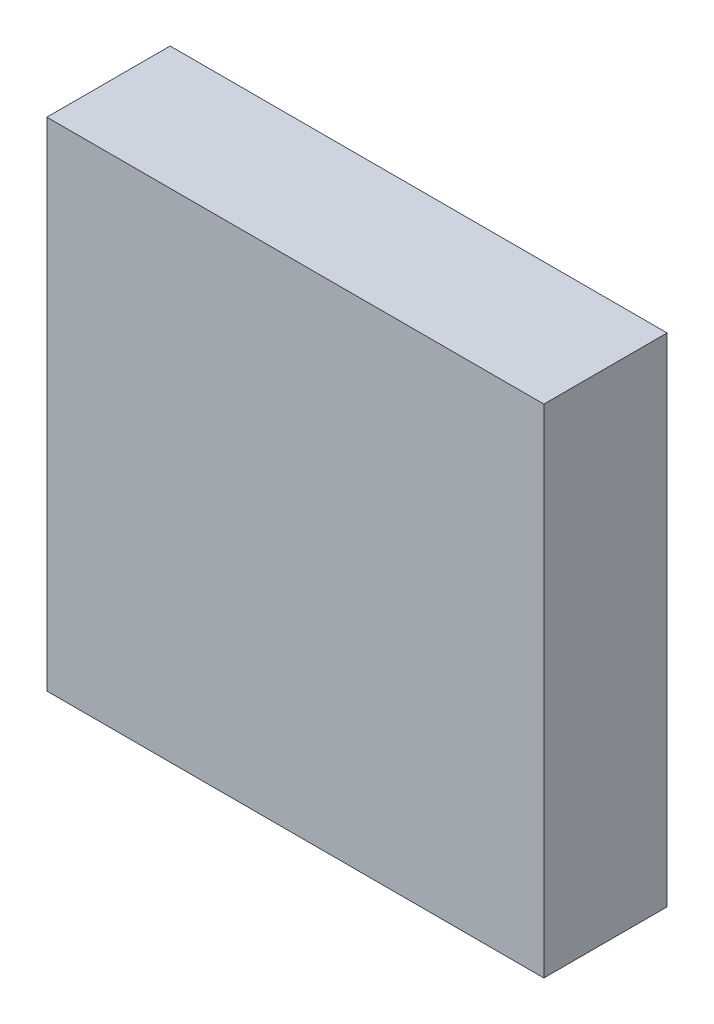
ISO-10303-21;
HEADER;
FILE_DESCRIPTION(('STEP AP214'),'2;1');
FILE_NAME('part.step','',(''),(''),'','','');
FILE_SCHEMA(('AUTOMOTIVE_DESIGN { 1 0 10303 214 1 1 1 1 }'));
ENDSEC;
DATA;
#1=APPLICATION_CONTEXT('core data for automotive mechanical design processes');
#2=APPLICATION_PROTOCOL_DEFINITION('international standard','automotive_design',2000,#1);
#3=PRODUCT_CONTEXT('',#1,'mechanical');
#4=PRODUCT('Part','Part','',(#3));
#5=PRODUCT_RELATED_PRODUCT_CATEGORY('part','',(#4));
#6=PRODUCT_DEFINITION_FORMATION('','',#4);
#7=PRODUCT_DEFINITION_CONTEXT('part definition',#1,'design');
#8=PRODUCT_DEFINITION('design','',#6,#7);
#9=PRODUCT_DEFINITION_SHAPE('','',#8);
#10=(LENGTH_UNIT() NAMED_UNIT(*) SI_UNIT(.MILLI.,.METRE.));
#11=(NAMED_UNIT(*) PLANE_ANGLE_UNIT() SI_UNIT($,.RADIAN.));
#12=(NAMED_UNIT(*) SI_UNIT($,.STERADIAN.) SOLID_ANGLE_UNIT());
#13=UNCERTAINTY_MEASURE_WITH_UNIT(LENGTH_MEASURE(1.E-05),#10,'distance_accuracy_value','');
#14=(GEOMETRIC_REPRESENTATION_CONTEXT(3) GLOBAL_UNCERTAINTY_ASSIGNED_CONTEXT((#13)) GLOBAL_UNIT_ASSIGNED_CONTEXT((#10,
#11,#12)) REPRESENTATION_CONTEXT('',''));
#15=CARTESIAN_POINT('',(0.,0.,0.));
#16=DIRECTION('',(0.,0.,1.));
#17=DIRECTION('',(1.,0.,0.));
#18=AXIS2_PLACEMENT_3D('',#15,#16,#17);
#19=CARTESIAN_POINT('',(-2.016,-2.016,1.));
#20=DIRECTION('',(1.,0.,0.));
#21=DIRECTION('',(0.,0.,-1.));
#22=AXIS2_PLACEMENT_3D('',#19,#20,#21);
#23=PLANE('',#22);
#24=DIRECTION('',(0.,-1.,0.));
#25=VECTOR('',#24,1.);
#26=CARTESIAN_POINT('',(-2.016,-2.016,0.));
#27=LINE('',#26,#25);
#28=CARTESIAN_POINT('',(-2.016,2.016,0.));
#29=VERTEX_POINT('',#28);
#30=CARTESIAN_POINT('',(-2.016,-2.016,0.));
#31=VERTEX_POINT('',#30);
#32=EDGE_CURVE('E95',#29,#31,#27,.T.);
#33=ORIENTED_EDGE('',*,*,#32,.T.);
#34=DIRECTION('',(0.,0.,-1.));
#35=VECTOR('',#34,1.);
#36=CARTESIAN_POINT('',(-2.016,-2.016,1.));
#37=LINE('',#36,#35);
#38=CARTESIAN_POINT('',(-2.016,-2.016,1.));
#39=VERTEX_POINT('',#38);
#40=EDGE_CURVE('E11',#39,#31,#37,.T.);
#41=ORIENTED_EDGE('',*,*,#40,.F.);
#42=DIRECTION('',(0.,-1.,0.));
#43=VECTOR('',#42,1.);
#44=CARTESIAN_POINT('',(-2.016,-2.016,1.));
#45=LINE('',#44,#43);
#46=CARTESIAN_POINT('',(-2.016,2.016,1.));
#47=VERTEX_POINT('',#46);
#48=EDGE_CURVE('E83',#47,#39,#45,.T.);
#49=ORIENTED_EDGE('',*,*,#48,.F.);
#50=DIRECTION('',(0.,0.,-1.));
#51=VECTOR('',#50,1.);
#52=CARTESIAN_POINT('',(-2.016,2.016,1.));
#53=LINE('',#52,#51);
#54=EDGE_CURVE('E91',#47,#29,#53,.T.);
#55=ORIENTED_EDGE('',*,*,#54,.T.);
#56=EDGE_LOOP('',(#33,#41,#49,#55));
#57=FACE_BOUND('',#56,.T.);
#58=ADVANCED_FACE('F32',(#57),#23,.F.);
#59=CARTESIAN_POINT('',(2.016,-2.016,1.));
#60=DIRECTION('',(0.,1.,0.));
#61=DIRECTION('',(0.,0.,1.));
#62=AXIS2_PLACEMENT_3D('',#59,#60,#61);
#63=PLANE('',#62);
#64=DIRECTION('',(1.,0.,0.));
#65=VECTOR('',#64,1.);
#66=CARTESIAN_POINT('',(2.016,-2.016,0.));
#67=LINE('',#66,#65);
#68=CARTESIAN_POINT('',(2.016,-2.016,0.));
#69=VERTEX_POINT('',#68);
#70=EDGE_CURVE('E87',#31,#69,#67,.T.);
#71=ORIENTED_EDGE('',*,*,#70,.T.);
#72=DIRECTION('',(0.,0.,-1.));
#73=VECTOR('',#72,1.);
#74=CARTESIAN_POINT('',(2.016,-2.016,1.));
#75=LINE('',#74,#73);
#76=CARTESIAN_POINT('',(2.016,-2.016,1.));
#77=VERTEX_POINT('',#76);
#78=EDGE_CURVE('E40',#77,#69,#75,.T.);
#79=ORIENTED_EDGE('',*,*,#78,.F.);
#80=DIRECTION('',(1.,0.,0.));
#81=VECTOR('',#80,1.);
#82=CARTESIAN_POINT('',(2.016,-2.016,1.));
#83=LINE('',#82,#81);
#84=EDGE_CURVE('E78',#39,#77,#83,.T.);
#85=ORIENTED_EDGE('',*,*,#84,.F.);
#86=ORIENTED_EDGE('',*,*,#40,.T.);
#87=EDGE_LOOP('',(#71,#79,#85,#86));
#88=FACE_BOUND('',#87,.T.);
#89=ADVANCED_FACE('F86',(#88),#63,.F.);
#90=CARTESIAN_POINT('',(2.016,2.016,1.));
#91=DIRECTION('',(-1.,0.,0.));
#92=DIRECTION('',(0.,0.,1.));
#93=AXIS2_PLACEMENT_3D('',#90,#91,#92);
#94=PLANE('',#93);
#95=DIRECTION('',(0.,1.,0.));
#96=VECTOR('',#95,1.);
#97=CARTESIAN_POINT('',(2.016,2.016,0.));
#98=LINE('',#97,#96);
#99=CARTESIAN_POINT('',(2.016,2.016,0.));
#100=VERTEX_POINT('',#99);
#101=EDGE_CURVE('E65',#69,#100,#98,.T.);
#102=ORIENTED_EDGE('',*,*,#101,.T.);
#103=DIRECTION('',(0.,0.,-1.));
#104=VECTOR('',#103,1.);
#105=CARTESIAN_POINT('',(2.016,2.016,1.));
#106=LINE('',#105,#104);
#107=CARTESIAN_POINT('',(2.016,2.016,1.));
#108=VERTEX_POINT('',#107);
#109=EDGE_CURVE('E88',#108,#100,#106,.T.);
#110=ORIENTED_EDGE('',*,*,#109,.F.);
#111=DIRECTION('',(0.,1.,0.));
#112=VECTOR('',#111,1.);
#113=CARTESIAN_POINT('',(2.016,2.016,1.));
#114=LINE('',#113,#112);
#115=EDGE_CURVE('E81',#77,#108,#114,.T.);
#116=ORIENTED_EDGE('',*,*,#115,.F.);
#117=ORIENTED_EDGE('',*,*,#78,.T.);
#118=EDGE_LOOP('',(#102,#110,#116,#117));
#119=FACE_BOUND('',#118,.T.);
#120=ADVANCED_FACE('F89',(#119),#94,.F.);
#121=CARTESIAN_POINT('',(-2.016,2.016,1.));
#122=DIRECTION('',(0.,-1.,0.));
#123=DIRECTION('',(0.,0.,-1.));
#124=AXIS2_PLACEMENT_3D('',#121,#122,#123);
#125=PLANE('',#124);
#126=DIRECTION('',(-1.,0.,0.));
#127=VECTOR('',#126,1.);
#128=CARTESIAN_POINT('',(-2.016,2.016,0.));
#129=LINE('',#128,#127);
#130=EDGE_CURVE('E71',#100,#29,#129,.T.);
#131=ORIENTED_EDGE('',*,*,#130,.T.);
#132=ORIENTED_EDGE('',*,*,#54,.F.);
#133=DIRECTION('',(-1.,0.,0.));
#134=VECTOR('',#133,1.);
#135=CARTESIAN_POINT('',(-2.016,2.016,1.));
#136=LINE('',#135,#134);
#137=EDGE_CURVE('E48',#108,#47,#136,.T.);
#138=ORIENTED_EDGE('',*,*,#137,.F.);
#139=ORIENTED_EDGE('',*,*,#109,.T.);
#140=EDGE_LOOP('',(#131,#132,#138,#139));
#141=FACE_BOUND('',#140,.T.);
#142=ADVANCED_FACE('F102',(#141),#125,.F.);
#143=CARTESIAN_POINT('',(0.,0.,1.));
#144=DIRECTION('',(0.,0.,-1.));
#145=DIRECTION('',(-1.,0.,0.));
#146=AXIS2_PLACEMENT_3D('',#143,#144,#145);
#147=PLANE('',#146);
#148=ORIENTED_EDGE('',*,*,#48,.T.);
#149=ORIENTED_EDGE('',*,*,#84,.T.);
#150=ORIENTED_EDGE('',*,*,#115,.T.);
#151=ORIENTED_EDGE('',*,*,#137,.T.);
#152=EDGE_LOOP('',(#148,#149,#150,#151));
#153=FACE_BOUND('',#152,.T.);
#154=ADVANCED_FACE('F79',(#153),#147,.F.);
#155=CARTESIAN_POINT('',(0.,0.,0.));
#156=DIRECTION('',(0.,0.,-1.));
#157=DIRECTION('',(-1.,0.,0.));
#158=AXIS2_PLACEMENT_3D('',#155,#156,#157);
#159=PLANE('',#158);
#160=ORIENTED_EDGE('',*,*,#32,.F.);
#161=ORIENTED_EDGE('',*,*,#130,.F.);
#162=ORIENTED_EDGE('',*,*,#101,.F.);
#163=ORIENTED_EDGE('',*,*,#70,.F.);
#164=EDGE_LOOP('',(#160,#161,#162,#163));
#165=FACE_BOUND('',#164,.T.);
#166=ADVANCED_FACE('F105',(#165),#159,.T.);
#167=CLOSED_SHELL('',(#58,#89,#120,#142,#154,#166));
#168=MANIFOLD_SOLID_BREP('B2',#167);
#169=ADVANCED_BREP_SHAPE_REPRESENTATION('',(#18,#168),#14);
#170=SHAPE_DEFINITION_REPRESENTATION(#9,#169);
ENDSEC;
END-ISO-10303-21;
